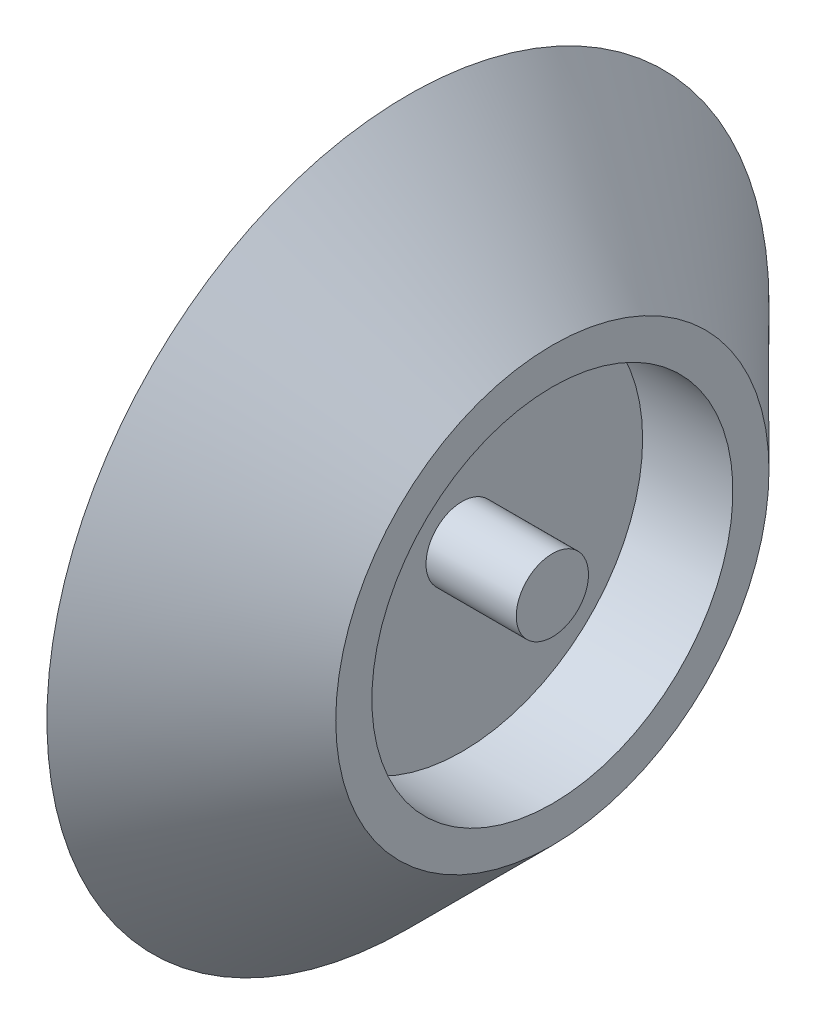
ISO-10303-21;
HEADER;
FILE_DESCRIPTION(('STEP AP214'),'2;1');
FILE_NAME('part.step','',(''),(''),'','','');
FILE_SCHEMA(('AUTOMOTIVE_DESIGN { 1 0 10303 214 1 1 1 1 }'));
ENDSEC;
DATA;
#1=APPLICATION_CONTEXT('core data for automotive mechanical design processes');
#2=APPLICATION_PROTOCOL_DEFINITION('international standard','automotive_design',2000,#1);
#3=PRODUCT_CONTEXT('',#1,'mechanical');
#4=PRODUCT('Part','Part','',(#3));
#5=PRODUCT_RELATED_PRODUCT_CATEGORY('part','',(#4));
#6=PRODUCT_DEFINITION_FORMATION('','',#4);
#7=PRODUCT_DEFINITION_CONTEXT('part definition',#1,'design');
#8=PRODUCT_DEFINITION('design','',#6,#7);
#9=PRODUCT_DEFINITION_SHAPE('','',#8);
#10=(LENGTH_UNIT() NAMED_UNIT(*) SI_UNIT(.MILLI.,.METRE.));
#11=(NAMED_UNIT(*) PLANE_ANGLE_UNIT() SI_UNIT($,.RADIAN.));
#12=(NAMED_UNIT(*) SI_UNIT($,.STERADIAN.) SOLID_ANGLE_UNIT());
#13=UNCERTAINTY_MEASURE_WITH_UNIT(LENGTH_MEASURE(1.E-05),#10,'distance_accuracy_value','');
#14=(GEOMETRIC_REPRESENTATION_CONTEXT(3) GLOBAL_UNCERTAINTY_ASSIGNED_CONTEXT((#13)) GLOBAL_UNIT_ASSIGNED_CONTEXT((#10,
#11,#12)) REPRESENTATION_CONTEXT('',''));
#15=CARTESIAN_POINT('',(0.,0.,0.));
#16=DIRECTION('',(0.,0.,1.));
#17=DIRECTION('',(1.,0.,0.));
#18=AXIS2_PLACEMENT_3D('',#15,#16,#17);
#19=CARTESIAN_POINT('',(1526.99999242226,169.,-415.));
#20=DIRECTION('',(1.,0.,0.));
#21=DIRECTION('',(0.,0.,-1.));
#22=AXIS2_PLACEMENT_3D('',#19,#20,#21);
#23=PLANE('',#22);
#24=CARTESIAN_POINT('',(1526.99999242226,169.,-415.));
#25=DIRECTION('',(-1.,0.,0.));
#26=DIRECTION('',(0.,-1.,0.));
#27=AXIS2_PLACEMENT_3D('',#24,#25,#26);
#28=CIRCLE('',#27,12.);
#29=CARTESIAN_POINT('',(1526.99999242226,157.,-415.));
#30=VERTEX_POINT('',#29);
#31=EDGE_CURVE('E21',#30,#30,#28,.T.);
#32=ORIENTED_EDGE('',*,*,#31,.F.);
#33=EDGE_LOOP('',(#32));
#34=FACE_BOUND('',#33,.T.);
#35=CARTESIAN_POINT('',(1526.99999242226,169.,-415.));
#36=DIRECTION('',(-1.,0.,0.));
#37=DIRECTION('',(0.,-1.,0.));
#38=AXIS2_PLACEMENT_3D('',#35,#36,#37);
#39=CIRCLE('',#38,10.);
#40=CARTESIAN_POINT('',(1526.99999242226,159.,-415.));
#41=VERTEX_POINT('',#40);
#42=EDGE_CURVE('E30',#41,#41,#39,.F.);
#43=ORIENTED_EDGE('',*,*,#42,.F.);
#44=EDGE_LOOP('',(#43));
#45=FACE_BOUND('',#44,.T.);
#46=ADVANCED_FACE('F15',(#34,#45),#23,.T.);
#47=CARTESIAN_POINT('',(1518.99999242226,169.,-415.));
#48=DIRECTION('',(1.,0.,0.));
#49=DIRECTION('',(0.,0.,-1.));
#50=AXIS2_PLACEMENT_3D('',#47,#48,#49);
#51=PLANE('',#50);
#52=CARTESIAN_POINT('',(1518.99999242226,169.,-415.));
#53=DIRECTION('',(-1.,0.,0.));
#54=DIRECTION('',(0.,0.,-1.));
#55=AXIS2_PLACEMENT_3D('',#52,#53,#54);
#56=CIRCLE('',#55,20.);
#57=CARTESIAN_POINT('',(1518.99999242226,169.,-435.));
#58=VERTEX_POINT('',#57);
#59=EDGE_CURVE('E25',#58,#58,#56,.T.);
#60=ORIENTED_EDGE('',*,*,#59,.T.);
#61=EDGE_LOOP('',(#60));
#62=FACE_BOUND('',#61,.T.);
#63=ADVANCED_FACE('F58',(#62),#51,.F.);
#64=CARTESIAN_POINT('',(1526.99999242226,169.,-415.));
#65=DIRECTION('',(-1.,0.,0.));
#66=DIRECTION('',(0.,0.,1.));
#67=AXIS2_PLACEMENT_3D('',#64,#65,#66);
#68=CONICAL_SURFACE('',#67,12.,0.785398163397448);
#69=ORIENTED_EDGE('',*,*,#59,.F.);
#70=EDGE_LOOP('',(#69));
#71=FACE_BOUND('',#70,.T.);
#72=ORIENTED_EDGE('',*,*,#31,.T.);
#73=EDGE_LOOP('',(#72));
#74=FACE_BOUND('',#73,.T.);
#75=ADVANCED_FACE('F63',(#71,#74),#68,.T.);
#76=CARTESIAN_POINT('',(1579.13141985061,169.,-415.));
#77=DIRECTION('',(-1.,0.,0.));
#78=DIRECTION('',(0.,0.,1.));
#79=AXIS2_PLACEMENT_3D('',#76,#77,#78);
#80=CYLINDRICAL_SURFACE('',#79,10.);
#81=ORIENTED_EDGE('',*,*,#42,.T.);
#82=EDGE_LOOP('',(#81));
#83=FACE_BOUND('',#82,.T.);
#84=CARTESIAN_POINT('',(1521.99999242226,169.,-415.));
#85=DIRECTION('',(-1.,0.,0.));
#86=DIRECTION('',(0.,0.,-1.));
#87=AXIS2_PLACEMENT_3D('',#84,#85,#86);
#88=CIRCLE('',#87,10.);
#89=CARTESIAN_POINT('',(1521.99999242226,169.,-425.));
#90=VERTEX_POINT('',#89);
#91=EDGE_CURVE('E34',#90,#90,#88,.T.);
#92=ORIENTED_EDGE('',*,*,#91,.T.);
#93=EDGE_LOOP('',(#92));
#94=FACE_BOUND('',#93,.T.);
#95=ADVANCED_FACE('F69',(#83,#94),#80,.F.);
#96=CARTESIAN_POINT('',(1521.99999242226,169.,-415.));
#97=DIRECTION('',(1.,0.,0.));
#98=DIRECTION('',(0.,0.,-1.));
#99=AXIS2_PLACEMENT_3D('',#96,#97,#98);
#100=PLANE('',#99);
#101=CARTESIAN_POINT('',(1521.99999242226,169.,-415.));
#102=DIRECTION('',(-1.,0.,0.));
#103=DIRECTION('',(0.,-1.,0.));
#104=AXIS2_PLACEMENT_3D('',#101,#102,#103);
#105=CIRCLE('',#104,2.);
#106=CARTESIAN_POINT('',(1521.99999242226,167.,-415.));
#107=VERTEX_POINT('',#106);
#108=EDGE_CURVE('E10',#107,#107,#105,.T.);
#109=ORIENTED_EDGE('',*,*,#108,.T.);
#110=EDGE_LOOP('',(#109));
#111=FACE_BOUND('',#110,.T.);
#112=ORIENTED_EDGE('',*,*,#91,.F.);
#113=EDGE_LOOP('',(#112));
#114=FACE_BOUND('',#113,.T.);
#115=ADVANCED_FACE('F54',(#111,#114),#100,.T.);
#116=CARTESIAN_POINT('',(1469.86856499392,169.,-415.));
#117=DIRECTION('',(1.,0.,0.));
#118=DIRECTION('',(0.,0.,-1.));
#119=AXIS2_PLACEMENT_3D('',#116,#117,#118);
#120=CYLINDRICAL_SURFACE('',#119,2.);
#121=ORIENTED_EDGE('',*,*,#108,.F.);
#122=EDGE_LOOP('',(#121));
#123=FACE_BOUND('',#122,.T.);
#124=CARTESIAN_POINT('',(1526.99999242226,169.,-415.));
#125=DIRECTION('',(-1.,0.,0.));
#126=DIRECTION('',(0.,0.,-1.));
#127=AXIS2_PLACEMENT_3D('',#124,#125,#126);
#128=CIRCLE('',#127,2.);
#129=CARTESIAN_POINT('',(1526.99999242226,169.,-417.));
#130=VERTEX_POINT('',#129);
#131=EDGE_CURVE('E38',#130,#130,#128,.T.);
#132=ORIENTED_EDGE('',*,*,#131,.T.);
#133=EDGE_LOOP('',(#132));
#134=FACE_BOUND('',#133,.T.);
#135=ADVANCED_FACE('F45',(#123,#134),#120,.T.);
#136=CARTESIAN_POINT('',(1526.99999242226,169.,-415.));
#137=DIRECTION('',(1.,0.,0.));
#138=DIRECTION('',(0.,0.,-1.));
#139=AXIS2_PLACEMENT_3D('',#136,#137,#138);
#140=PLANE('',#139);
#141=ORIENTED_EDGE('',*,*,#131,.F.);
#142=EDGE_LOOP('',(#141));
#143=FACE_BOUND('',#142,.T.);
#144=ADVANCED_FACE('F47',(#143),#140,.T.);
#145=CLOSED_SHELL('',(#46,#63,#75,#95,#115,#135,#144));
#146=MANIFOLD_SOLID_BREP('B1',#145);
#147=ADVANCED_BREP_SHAPE_REPRESENTATION('',(#18,#146),#14);
#148=SHAPE_DEFINITION_REPRESENTATION(#9,#147);
ENDSEC;
END-ISO-10303-21;
